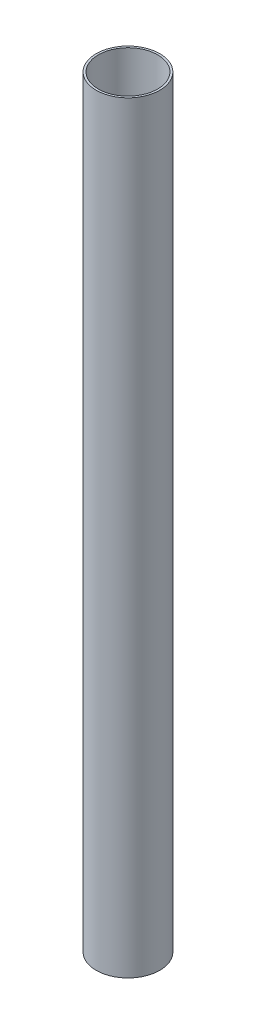
ISO-10303-21;
HEADER;
FILE_DESCRIPTION(('STEP AP214'),'2;1');
FILE_NAME('part.step','',(''),(''),'','','');
FILE_SCHEMA(('AUTOMOTIVE_DESIGN { 1 0 10303 214 1 1 1 1 }'));
ENDSEC;
DATA;
#1=APPLICATION_CONTEXT('core data for automotive mechanical design processes');
#2=APPLICATION_PROTOCOL_DEFINITION('international standard','automotive_design',2000,#1);
#3=PRODUCT_CONTEXT('',#1,'mechanical');
#4=PRODUCT('Part','Part','',(#3));
#5=PRODUCT_RELATED_PRODUCT_CATEGORY('part','',(#4));
#6=PRODUCT_DEFINITION_FORMATION('','',#4);
#7=PRODUCT_DEFINITION_CONTEXT('part definition',#1,'design');
#8=PRODUCT_DEFINITION('design','',#6,#7);
#9=PRODUCT_DEFINITION_SHAPE('','',#8);
#10=(LENGTH_UNIT() NAMED_UNIT(*) SI_UNIT(.MILLI.,.METRE.));
#11=(NAMED_UNIT(*) PLANE_ANGLE_UNIT() SI_UNIT($,.RADIAN.));
#12=(NAMED_UNIT(*) SI_UNIT($,.STERADIAN.) SOLID_ANGLE_UNIT());
#13=UNCERTAINTY_MEASURE_WITH_UNIT(LENGTH_MEASURE(1.E-05),#10,'distance_accuracy_value','');
#14=(GEOMETRIC_REPRESENTATION_CONTEXT(3) GLOBAL_UNCERTAINTY_ASSIGNED_CONTEXT((#13)) GLOBAL_UNIT_ASSIGNED_CONTEXT((#10,
#11,#12)) REPRESENTATION_CONTEXT('',''));
#15=CARTESIAN_POINT('',(0.,0.,0.));
#16=DIRECTION('',(0.,0.,1.));
#17=DIRECTION('',(1.,0.,0.));
#18=AXIS2_PLACEMENT_3D('',#15,#16,#17);
#19=CARTESIAN_POINT('',(0.,609.6,0.));
#20=DIRECTION('',(0.,1.,0.));
#21=DIRECTION('',(0.,0.,1.));
#22=AXIS2_PLACEMENT_3D('',#19,#20,#21);
#23=PLANE('',#22);
#24=CARTESIAN_POINT('',(0.,609.6,0.));
#25=DIRECTION('',(0.,1.,0.));
#26=DIRECTION('',(0.,0.,1.));
#27=AXIS2_PLACEMENT_3D('',#24,#25,#26);
#28=CIRCLE('',#27,25.4);
#29=CARTESIAN_POINT('',(0.,609.6,25.4));
#30=VERTEX_POINT('',#29);
#31=EDGE_CURVE('E10',#30,#30,#28,.T.);
#32=ORIENTED_EDGE('',*,*,#31,.T.);
#33=EDGE_LOOP('',(#32));
#34=FACE_BOUND('',#33,.T.);
#35=CARTESIAN_POINT('',(0.,609.6,0.));
#36=DIRECTION('',(0.,1.,0.));
#37=DIRECTION('',(0.,0.,1.));
#38=AXIS2_PLACEMENT_3D('',#35,#36,#37);
#39=CIRCLE('',#38,23.749);
#40=CARTESIAN_POINT('',(0.,609.6,23.749));
#41=VERTEX_POINT('',#40);
#42=EDGE_CURVE('E42',#41,#41,#39,.T.);
#43=ORIENTED_EDGE('',*,*,#42,.F.);
#44=EDGE_LOOP('',(#43));
#45=FACE_BOUND('',#44,.T.);
#46=ADVANCED_FACE('F31',(#34,#45),#23,.T.);
#47=CARTESIAN_POINT('',(0.,0.,0.));
#48=DIRECTION('',(0.,1.,0.));
#49=DIRECTION('',(0.,0.,1.));
#50=AXIS2_PLACEMENT_3D('',#47,#48,#49);
#51=PLANE('',#50);
#52=CARTESIAN_POINT('',(0.,0.,0.));
#53=DIRECTION('',(0.,1.,0.));
#54=DIRECTION('',(0.,0.,1.));
#55=AXIS2_PLACEMENT_3D('',#52,#53,#54);
#56=CIRCLE('',#55,25.4);
#57=CARTESIAN_POINT('',(0.,0.,25.4));
#58=VERTEX_POINT('',#57);
#59=EDGE_CURVE('E35',#58,#58,#56,.T.);
#60=ORIENTED_EDGE('',*,*,#59,.F.);
#61=EDGE_LOOP('',(#60));
#62=FACE_BOUND('',#61,.T.);
#63=CARTESIAN_POINT('',(0.,0.,0.));
#64=DIRECTION('',(0.,1.,0.));
#65=DIRECTION('',(0.,0.,1.));
#66=AXIS2_PLACEMENT_3D('',#63,#64,#65);
#67=CIRCLE('',#66,23.749);
#68=CARTESIAN_POINT('',(0.,0.,23.749));
#69=VERTEX_POINT('',#68);
#70=EDGE_CURVE('E44',#69,#69,#67,.T.);
#71=ORIENTED_EDGE('',*,*,#70,.T.);
#72=EDGE_LOOP('',(#71));
#73=FACE_BOUND('',#72,.T.);
#74=ADVANCED_FACE('F54',(#62,#73),#51,.F.);
#75=CARTESIAN_POINT('',(0.,609.6,0.));
#76=DIRECTION('',(0.,-1.,0.));
#77=DIRECTION('',(0.,0.,-1.));
#78=AXIS2_PLACEMENT_3D('',#75,#76,#77);
#79=CYLINDRICAL_SURFACE('',#78,25.4);
#80=ORIENTED_EDGE('',*,*,#31,.F.);
#81=EDGE_LOOP('',(#80));
#82=FACE_BOUND('',#81,.T.);
#83=ORIENTED_EDGE('',*,*,#59,.T.);
#84=EDGE_LOOP('',(#83));
#85=FACE_BOUND('',#84,.T.);
#86=ADVANCED_FACE('F33',(#82,#85),#79,.T.);
#87=CARTESIAN_POINT('',(0.,609.6,0.));
#88=DIRECTION('',(0.,-1.,0.));
#89=DIRECTION('',(0.,0.,-1.));
#90=AXIS2_PLACEMENT_3D('',#87,#88,#89);
#91=CYLINDRICAL_SURFACE('',#90,23.749);
#92=ORIENTED_EDGE('',*,*,#42,.T.);
#93=EDGE_LOOP('',(#92));
#94=FACE_BOUND('',#93,.T.);
#95=ORIENTED_EDGE('',*,*,#70,.F.);
#96=EDGE_LOOP('',(#95));
#97=FACE_BOUND('',#96,.T.);
#98=ADVANCED_FACE('F50',(#94,#97),#91,.F.);
#99=CLOSED_SHELL('',(#46,#74,#86,#98));
#100=MANIFOLD_SOLID_BREP('B2',#99);
#101=ADVANCED_BREP_SHAPE_REPRESENTATION('',(#18,#100),#14);
#102=SHAPE_DEFINITION_REPRESENTATION(#9,#101);
ENDSEC;
END-ISO-10303-21;
